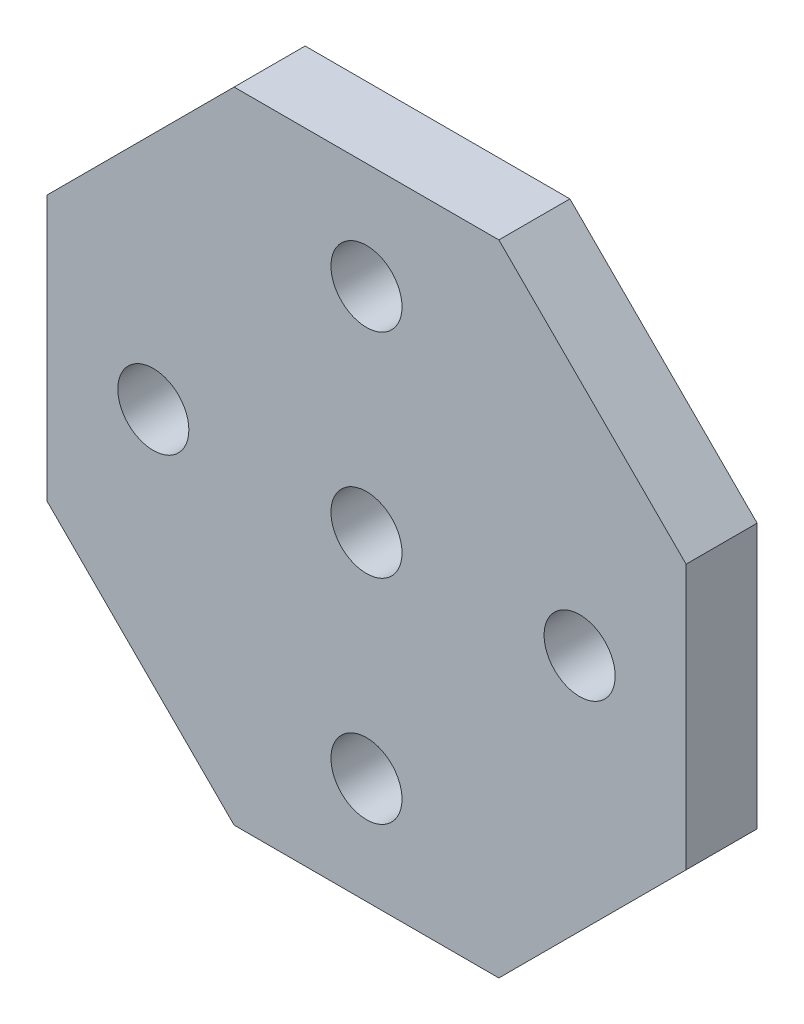
ISO-10303-21;
HEADER;
FILE_DESCRIPTION(('STEP AP214'),'2;1');
FILE_NAME('part.step','',(''),(''),'','','');
FILE_SCHEMA(('AUTOMOTIVE_DESIGN { 1 0 10303 214 1 1 1 1 }'));
ENDSEC;
DATA;
#1=APPLICATION_CONTEXT('core data for automotive mechanical design processes');
#2=APPLICATION_PROTOCOL_DEFINITION('international standard','automotive_design',2000,#1);
#3=PRODUCT_CONTEXT('',#1,'mechanical');
#4=PRODUCT('Part','Part','',(#3));
#5=PRODUCT_RELATED_PRODUCT_CATEGORY('part','',(#4));
#6=PRODUCT_DEFINITION_FORMATION('','',#4);
#7=PRODUCT_DEFINITION_CONTEXT('part definition',#1,'design');
#8=PRODUCT_DEFINITION('design','',#6,#7);
#9=PRODUCT_DEFINITION_SHAPE('','',#8);
#10=(LENGTH_UNIT() NAMED_UNIT(*) SI_UNIT(.MILLI.,.METRE.));
#11=(NAMED_UNIT(*) PLANE_ANGLE_UNIT() SI_UNIT($,.RADIAN.));
#12=(NAMED_UNIT(*) SI_UNIT($,.STERADIAN.) SOLID_ANGLE_UNIT());
#13=UNCERTAINTY_MEASURE_WITH_UNIT(LENGTH_MEASURE(1.E-05),#10,'distance_accuracy_value','');
#14=(GEOMETRIC_REPRESENTATION_CONTEXT(3) GLOBAL_UNCERTAINTY_ASSIGNED_CONTEXT((#13)) GLOBAL_UNIT_ASSIGNED_CONTEXT((#10,
#11,#12)) REPRESENTATION_CONTEXT('',''));
#15=CARTESIAN_POINT('',(0.,0.,0.));
#16=DIRECTION('',(0.,0.,1.));
#17=DIRECTION('',(1.,0.,0.));
#18=AXIS2_PLACEMENT_3D('',#15,#16,#17);
#19=CARTESIAN_POINT('',(0.,0.,3.));
#20=DIRECTION('',(0.,0.,-1.));
#21=DIRECTION('',(-1.,0.,0.));
#22=AXIS2_PLACEMENT_3D('',#19,#20,#21);
#23=PLANE('',#22);
#24=CARTESIAN_POINT('',(224.7478079135,241.9520199932,3.));
#25=DIRECTION('',(0.,0.,1.));
#26=DIRECTION('',(1.,0.,0.));
#27=AXIS2_PLACEMENT_3D('',#24,#25,#26);
#28=CIRCLE('',#27,1.5);
#29=CARTESIAN_POINT('',(226.2478079135,241.9520199932,3.));
#30=VERTEX_POINT('',#29);
#31=EDGE_CURVE('E194',#30,#30,#28,.T.);
#32=ORIENTED_EDGE('',*,*,#31,.F.);
#33=EDGE_LOOP('',(#32));
#34=FACE_BOUND('',#33,.T.);
#35=CARTESIAN_POINT('',(215.7478079135,232.9520199932,3.));
#36=DIRECTION('',(0.,0.,1.));
#37=DIRECTION('',(1.,0.,0.));
#38=AXIS2_PLACEMENT_3D('',#35,#36,#37);
#39=CIRCLE('',#38,1.5);
#40=CARTESIAN_POINT('',(217.2478079135,232.9520199932,3.));
#41=VERTEX_POINT('',#40);
#42=EDGE_CURVE('E182',#41,#41,#39,.T.);
#43=ORIENTED_EDGE('',*,*,#42,.F.);
#44=EDGE_LOOP('',(#43));
#45=FACE_BOUND('',#44,.T.);
#46=DIRECTION('',(0.707106781186547,0.707106781186547,0.));
#47=VECTOR('',#46,1.);
#48=CARTESIAN_POINT('',(229.2428079135,236.362207969,3.));
#49=LINE('',#48,#47);
#50=CARTESIAN_POINT('',(221.3376199377,228.4570199932,3.));
#51=VERTEX_POINT('',#50);
#52=CARTESIAN_POINT('',(229.2428079135,236.362207969,3.));
#53=VERTEX_POINT('',#52);
#54=EDGE_CURVE('E145',#51,#53,#49,.T.);
#55=ORIENTED_EDGE('',*,*,#54,.T.);
#56=DIRECTION('',(0.,1.,0.));
#57=VECTOR('',#56,1.);
#58=CARTESIAN_POINT('',(229.2428079135,247.5418320174,3.));
#59=LINE('',#58,#57);
#60=CARTESIAN_POINT('',(229.2428079135,247.5418320174,3.));
#61=VERTEX_POINT('',#60);
#62=EDGE_CURVE('E93',#53,#61,#59,.T.);
#63=ORIENTED_EDGE('',*,*,#62,.T.);
#64=DIRECTION('',(-0.707106781186547,0.707106781186547,0.));
#65=VECTOR('',#64,1.);
#66=CARTESIAN_POINT('',(221.3376199377,255.4470199932,3.));
#67=LINE('',#66,#65);
#68=CARTESIAN_POINT('',(221.3376199377,255.4470199932,3.));
#69=VERTEX_POINT('',#68);
#70=EDGE_CURVE('E160',#61,#69,#67,.T.);
#71=ORIENTED_EDGE('',*,*,#70,.T.);
#72=DIRECTION('',(-1.,0.,0.));
#73=VECTOR('',#72,1.);
#74=CARTESIAN_POINT('',(210.1579958893,255.4470199932,3.));
#75=LINE('',#74,#73);
#76=CARTESIAN_POINT('',(210.1579958893,255.4470199932,3.));
#77=VERTEX_POINT('',#76);
#78=EDGE_CURVE('E173',#69,#77,#75,.T.);
#79=ORIENTED_EDGE('',*,*,#78,.T.);
#80=DIRECTION('',(-0.707106781186547,-0.707106781186547,0.));
#81=VECTOR('',#80,1.);
#82=CARTESIAN_POINT('',(202.2528079135,247.5418320174,3.));
#83=LINE('',#82,#81);
#84=CARTESIAN_POINT('',(202.2528079135,247.5418320174,3.));
#85=VERTEX_POINT('',#84);
#86=EDGE_CURVE('E112',#77,#85,#83,.T.);
#87=ORIENTED_EDGE('',*,*,#86,.T.);
#88=DIRECTION('',(0.,-1.,0.));
#89=VECTOR('',#88,1.);
#90=CARTESIAN_POINT('',(202.2528079135,236.362207969,3.));
#91=LINE('',#90,#89);
#92=CARTESIAN_POINT('',(202.2528079135,236.362207969,3.));
#93=VERTEX_POINT('',#92);
#94=EDGE_CURVE('E106',#85,#93,#91,.T.);
#95=ORIENTED_EDGE('',*,*,#94,.T.);
#96=DIRECTION('',(0.707106781186547,-0.707106781186547,0.));
#97=VECTOR('',#96,1.);
#98=CARTESIAN_POINT('',(210.1579958893,228.4570199932,3.));
#99=LINE('',#98,#97);
#100=CARTESIAN_POINT('',(210.1579958893,228.4570199932,3.));
#101=VERTEX_POINT('',#100);
#102=EDGE_CURVE('E110',#93,#101,#99,.T.);
#103=ORIENTED_EDGE('',*,*,#102,.T.);
#104=DIRECTION('',(1.,0.,0.));
#105=VECTOR('',#104,1.);
#106=CARTESIAN_POINT('',(221.3376199377,228.4570199932,3.));
#107=LINE('',#106,#105);
#108=EDGE_CURVE('E50',#101,#51,#107,.T.);
#109=ORIENTED_EDGE('',*,*,#108,.T.);
#110=EDGE_LOOP('',(#55,#63,#71,#79,#87,#95,#103,#109));
#111=FACE_BOUND('',#110,.T.);
#112=CARTESIAN_POINT('',(215.7478079135,241.9520199932,3.));
#113=DIRECTION('',(0.,0.,1.));
#114=DIRECTION('',(1.,0.,0.));
#115=AXIS2_PLACEMENT_3D('',#112,#113,#114);
#116=CIRCLE('',#115,1.5);
#117=CARTESIAN_POINT('',(217.2478079135,241.9520199932,3.));
#118=VERTEX_POINT('',#117);
#119=EDGE_CURVE('E134',#118,#118,#116,.T.);
#120=ORIENTED_EDGE('',*,*,#119,.F.);
#121=EDGE_LOOP('',(#120));
#122=FACE_BOUND('',#121,.T.);
#123=CARTESIAN_POINT('',(215.7478079135,250.9520199932,3.));
#124=DIRECTION('',(0.,0.,1.));
#125=DIRECTION('',(1.,0.,0.));
#126=AXIS2_PLACEMENT_3D('',#123,#124,#125);
#127=CIRCLE('',#126,1.5);
#128=CARTESIAN_POINT('',(217.2478079135,250.9520199932,3.));
#129=VERTEX_POINT('',#128);
#130=EDGE_CURVE('E188',#129,#129,#127,.T.);
#131=ORIENTED_EDGE('',*,*,#130,.F.);
#132=EDGE_LOOP('',(#131));
#133=FACE_BOUND('',#132,.T.);
#134=CARTESIAN_POINT('',(206.7478079135,241.9520199932,3.));
#135=DIRECTION('',(0.,0.,1.));
#136=DIRECTION('',(1.,0.,0.));
#137=AXIS2_PLACEMENT_3D('',#134,#135,#136);
#138=CIRCLE('',#137,1.5);
#139=CARTESIAN_POINT('',(208.2478079135,241.9520199932,3.));
#140=VERTEX_POINT('',#139);
#141=EDGE_CURVE('E200',#140,#140,#138,.T.);
#142=ORIENTED_EDGE('',*,*,#141,.F.);
#143=EDGE_LOOP('',(#142));
#144=FACE_BOUND('',#143,.T.);
#145=ADVANCED_FACE('F33',(#34,#45,#111,#122,#133,#144),#23,.F.);
#146=CARTESIAN_POINT('',(0.,0.,0.));
#147=DIRECTION('',(0.,0.,-1.));
#148=DIRECTION('',(-1.,0.,0.));
#149=AXIS2_PLACEMENT_3D('',#146,#147,#148);
#150=PLANE('',#149);
#151=CARTESIAN_POINT('',(224.7478079135,241.9520199932,0.));
#152=DIRECTION('',(0.,0.,1.));
#153=DIRECTION('',(1.,0.,0.));
#154=AXIS2_PLACEMENT_3D('',#151,#152,#153);
#155=CIRCLE('',#154,1.5);
#156=CARTESIAN_POINT('',(226.2478079135,241.9520199932,0.));
#157=VERTEX_POINT('',#156);
#158=EDGE_CURVE('E197',#157,#157,#155,.T.);
#159=ORIENTED_EDGE('',*,*,#158,.T.);
#160=EDGE_LOOP('',(#159));
#161=FACE_BOUND('',#160,.T.);
#162=CARTESIAN_POINT('',(215.7478079135,232.9520199932,0.));
#163=DIRECTION('',(0.,0.,1.));
#164=DIRECTION('',(1.,0.,0.));
#165=AXIS2_PLACEMENT_3D('',#162,#163,#164);
#166=CIRCLE('',#165,1.5);
#167=CARTESIAN_POINT('',(217.2478079135,232.9520199932,0.));
#168=VERTEX_POINT('',#167);
#169=EDGE_CURVE('E185',#168,#168,#166,.T.);
#170=ORIENTED_EDGE('',*,*,#169,.T.);
#171=EDGE_LOOP('',(#170));
#172=FACE_BOUND('',#171,.T.);
#173=DIRECTION('',(0.707106781186547,0.707106781186547,0.));
#174=VECTOR('',#173,1.);
#175=CARTESIAN_POINT('',(229.2428079135,236.362207969,0.));
#176=LINE('',#175,#174);
#177=CARTESIAN_POINT('',(221.3376199377,228.4570199932,0.));
#178=VERTEX_POINT('',#177);
#179=CARTESIAN_POINT('',(229.2428079135,236.362207969,0.));
#180=VERTEX_POINT('',#179);
#181=EDGE_CURVE('E130',#178,#180,#176,.T.);
#182=ORIENTED_EDGE('',*,*,#181,.F.);
#183=DIRECTION('',(1.,0.,0.));
#184=VECTOR('',#183,1.);
#185=CARTESIAN_POINT('',(221.3376199377,228.4570199932,0.));
#186=LINE('',#185,#184);
#187=CARTESIAN_POINT('',(210.1579958893,228.4570199932,0.));
#188=VERTEX_POINT('',#187);
#189=EDGE_CURVE('E85',#188,#178,#186,.T.);
#190=ORIENTED_EDGE('',*,*,#189,.F.);
#191=DIRECTION('',(0.707106781186547,-0.707106781186547,0.));
#192=VECTOR('',#191,1.);
#193=CARTESIAN_POINT('',(210.1579958893,228.4570199932,0.));
#194=LINE('',#193,#192);
#195=CARTESIAN_POINT('',(202.2528079135,236.362207969,0.));
#196=VERTEX_POINT('',#195);
#197=EDGE_CURVE('E79',#196,#188,#194,.T.);
#198=ORIENTED_EDGE('',*,*,#197,.F.);
#199=DIRECTION('',(0.,-1.,0.));
#200=VECTOR('',#199,1.);
#201=CARTESIAN_POINT('',(202.2528079135,236.362207969,0.));
#202=LINE('',#201,#200);
#203=CARTESIAN_POINT('',(202.2528079135,247.5418320174,0.));
#204=VERTEX_POINT('',#203);
#205=EDGE_CURVE('E120',#204,#196,#202,.T.);
#206=ORIENTED_EDGE('',*,*,#205,.F.);
#207=DIRECTION('',(-0.707106781186547,-0.707106781186547,0.));
#208=VECTOR('',#207,1.);
#209=CARTESIAN_POINT('',(202.2528079135,247.5418320174,0.));
#210=LINE('',#209,#208);
#211=CARTESIAN_POINT('',(210.1579958893,255.4470199932,0.));
#212=VERTEX_POINT('',#211);
#213=EDGE_CURVE('E140',#212,#204,#210,.T.);
#214=ORIENTED_EDGE('',*,*,#213,.F.);
#215=DIRECTION('',(-1.,0.,0.));
#216=VECTOR('',#215,1.);
#217=CARTESIAN_POINT('',(210.1579958893,255.4470199932,0.));
#218=LINE('',#217,#216);
#219=CARTESIAN_POINT('',(221.3376199377,255.4470199932,0.));
#220=VERTEX_POINT('',#219);
#221=EDGE_CURVE('E138',#220,#212,#218,.T.);
#222=ORIENTED_EDGE('',*,*,#221,.F.);
#223=DIRECTION('',(-0.707106781186547,0.707106781186547,0.));
#224=VECTOR('',#223,1.);
#225=CARTESIAN_POINT('',(221.3376199377,255.4470199932,0.));
#226=LINE('',#225,#224);
#227=CARTESIAN_POINT('',(229.2428079135,247.5418320174,0.));
#228=VERTEX_POINT('',#227);
#229=EDGE_CURVE('E136',#228,#220,#226,.T.);
#230=ORIENTED_EDGE('',*,*,#229,.F.);
#231=DIRECTION('',(0.,1.,0.));
#232=VECTOR('',#231,1.);
#233=CARTESIAN_POINT('',(229.2428079135,247.5418320174,0.));
#234=LINE('',#233,#232);
#235=EDGE_CURVE('E133',#180,#228,#234,.T.);
#236=ORIENTED_EDGE('',*,*,#235,.F.);
#237=EDGE_LOOP('',(#182,#190,#198,#206,#214,#222,#230,#236));
#238=FACE_BOUND('',#237,.T.);
#239=CARTESIAN_POINT('',(215.7478079135,241.9520199932,0.));
#240=DIRECTION('',(0.,0.,1.));
#241=DIRECTION('',(1.,0.,0.));
#242=AXIS2_PLACEMENT_3D('',#239,#240,#241);
#243=CIRCLE('',#242,1.5);
#244=CARTESIAN_POINT('',(217.2478079135,241.9520199932,0.));
#245=VERTEX_POINT('',#244);
#246=EDGE_CURVE('E179',#245,#245,#243,.T.);
#247=ORIENTED_EDGE('',*,*,#246,.T.);
#248=EDGE_LOOP('',(#247));
#249=FACE_BOUND('',#248,.T.);
#250=CARTESIAN_POINT('',(215.7478079135,250.9520199932,0.));
#251=DIRECTION('',(0.,0.,1.));
#252=DIRECTION('',(1.,0.,0.));
#253=AXIS2_PLACEMENT_3D('',#250,#251,#252);
#254=CIRCLE('',#253,1.5);
#255=CARTESIAN_POINT('',(217.2478079135,250.9520199932,0.));
#256=VERTEX_POINT('',#255);
#257=EDGE_CURVE('E191',#256,#256,#254,.T.);
#258=ORIENTED_EDGE('',*,*,#257,.T.);
#259=EDGE_LOOP('',(#258));
#260=FACE_BOUND('',#259,.T.);
#261=CARTESIAN_POINT('',(206.7478079135,241.9520199932,0.));
#262=DIRECTION('',(0.,0.,1.));
#263=DIRECTION('',(1.,0.,0.));
#264=AXIS2_PLACEMENT_3D('',#261,#262,#263);
#265=CIRCLE('',#264,1.5);
#266=CARTESIAN_POINT('',(208.2478079135,241.9520199932,0.));
#267=VERTEX_POINT('',#266);
#268=EDGE_CURVE('E203',#267,#267,#265,.T.);
#269=ORIENTED_EDGE('',*,*,#268,.T.);
#270=EDGE_LOOP('',(#269));
#271=FACE_BOUND('',#270,.T.);
#272=ADVANCED_FACE('F164',(#161,#172,#238,#249,#260,#271),#150,.T.);
#273=CARTESIAN_POINT('',(229.2428079135,236.362207969,3.));
#274=DIRECTION('',(-0.707106781186548,0.707106781186548,0.));
#275=DIRECTION('',(-0.707106781186548,-0.707106781186548,0.));
#276=AXIS2_PLACEMENT_3D('',#273,#274,#275);
#277=PLANE('',#276);
#278=ORIENTED_EDGE('',*,*,#181,.T.);
#279=DIRECTION('',(0.,0.,-1.));
#280=VECTOR('',#279,1.);
#281=CARTESIAN_POINT('',(229.2428079135,236.362207969,3.));
#282=LINE('',#281,#280);
#283=EDGE_CURVE('E11',#53,#180,#282,.T.);
#284=ORIENTED_EDGE('',*,*,#283,.F.);
#285=ORIENTED_EDGE('',*,*,#54,.F.);
#286=DIRECTION('',(0.,0.,-1.));
#287=VECTOR('',#286,1.);
#288=CARTESIAN_POINT('',(221.3376199377,228.4570199932,3.));
#289=LINE('',#288,#287);
#290=EDGE_CURVE('E126',#51,#178,#289,.T.);
#291=ORIENTED_EDGE('',*,*,#290,.T.);
#292=EDGE_LOOP('',(#278,#284,#285,#291));
#293=FACE_BOUND('',#292,.T.);
#294=ADVANCED_FACE('F35',(#293),#277,.F.);
#295=CARTESIAN_POINT('',(229.2428079135,247.5418320174,3.));
#296=DIRECTION('',(-1.,0.,0.));
#297=DIRECTION('',(0.,0.,1.));
#298=AXIS2_PLACEMENT_3D('',#295,#296,#297);
#299=PLANE('',#298);
#300=ORIENTED_EDGE('',*,*,#235,.T.);
#301=DIRECTION('',(0.,0.,-1.));
#302=VECTOR('',#301,1.);
#303=CARTESIAN_POINT('',(229.2428079135,247.5418320174,3.));
#304=LINE('',#303,#302);
#305=EDGE_CURVE('E42',#61,#228,#304,.T.);
#306=ORIENTED_EDGE('',*,*,#305,.F.);
#307=ORIENTED_EDGE('',*,*,#62,.F.);
#308=ORIENTED_EDGE('',*,*,#283,.T.);
#309=EDGE_LOOP('',(#300,#306,#307,#308));
#310=FACE_BOUND('',#309,.T.);
#311=ADVANCED_FACE('F238',(#310),#299,.F.);
#312=CARTESIAN_POINT('',(221.3376199377,255.4470199932,3.));
#313=DIRECTION('',(-0.707106781186548,-0.707106781186548,0.));
#314=DIRECTION('',(0.707106781186548,-0.707106781186548,0.));
#315=AXIS2_PLACEMENT_3D('',#312,#313,#314);
#316=PLANE('',#315);
#317=ORIENTED_EDGE('',*,*,#229,.T.);
#318=DIRECTION('',(0.,0.,-1.));
#319=VECTOR('',#318,1.);
#320=CARTESIAN_POINT('',(221.3376199377,255.4470199932,3.));
#321=LINE('',#320,#319);
#322=EDGE_CURVE('E152',#69,#220,#321,.T.);
#323=ORIENTED_EDGE('',*,*,#322,.F.);
#324=ORIENTED_EDGE('',*,*,#70,.F.);
#325=ORIENTED_EDGE('',*,*,#305,.T.);
#326=EDGE_LOOP('',(#317,#323,#324,#325));
#327=FACE_BOUND('',#326,.T.);
#328=ADVANCED_FACE('F158',(#327),#316,.F.);
#329=CARTESIAN_POINT('',(210.1579958893,255.4470199932,3.));
#330=DIRECTION('',(0.,-1.,0.));
#331=DIRECTION('',(0.,0.,-1.));
#332=AXIS2_PLACEMENT_3D('',#329,#330,#331);
#333=PLANE('',#332);
#334=ORIENTED_EDGE('',*,*,#221,.T.);
#335=DIRECTION('',(0.,0.,-1.));
#336=VECTOR('',#335,1.);
#337=CARTESIAN_POINT('',(210.1579958893,255.4470199932,3.));
#338=LINE('',#337,#336);
#339=EDGE_CURVE('E149',#77,#212,#338,.T.);
#340=ORIENTED_EDGE('',*,*,#339,.F.);
#341=ORIENTED_EDGE('',*,*,#78,.F.);
#342=ORIENTED_EDGE('',*,*,#322,.T.);
#343=EDGE_LOOP('',(#334,#340,#341,#342));
#344=FACE_BOUND('',#343,.T.);
#345=ADVANCED_FACE('F169',(#344),#333,.F.);
#346=CARTESIAN_POINT('',(202.2528079135,247.5418320174,3.));
#347=DIRECTION('',(0.707106781186548,-0.707106781186548,0.));
#348=DIRECTION('',(0.707106781186548,0.707106781186548,0.));
#349=AXIS2_PLACEMENT_3D('',#346,#347,#348);
#350=PLANE('',#349);
#351=ORIENTED_EDGE('',*,*,#213,.T.);
#352=DIRECTION('',(0.,0.,-1.));
#353=VECTOR('',#352,1.);
#354=CARTESIAN_POINT('',(202.2528079135,247.5418320174,3.));
#355=LINE('',#354,#353);
#356=EDGE_CURVE('E121',#85,#204,#355,.T.);
#357=ORIENTED_EDGE('',*,*,#356,.F.);
#358=ORIENTED_EDGE('',*,*,#86,.F.);
#359=ORIENTED_EDGE('',*,*,#339,.T.);
#360=EDGE_LOOP('',(#351,#357,#358,#359));
#361=FACE_BOUND('',#360,.T.);
#362=ADVANCED_FACE('F172',(#361),#350,.F.);
#363=CARTESIAN_POINT('',(202.2528079135,236.362207969,3.));
#364=DIRECTION('',(1.,0.,0.));
#365=DIRECTION('',(0.,0.,-1.));
#366=AXIS2_PLACEMENT_3D('',#363,#364,#365);
#367=PLANE('',#366);
#368=ORIENTED_EDGE('',*,*,#205,.T.);
#369=DIRECTION('',(0.,0.,-1.));
#370=VECTOR('',#369,1.);
#371=CARTESIAN_POINT('',(202.2528079135,236.362207969,3.));
#372=LINE('',#371,#370);
#373=EDGE_CURVE('E117',#93,#196,#372,.T.);
#374=ORIENTED_EDGE('',*,*,#373,.F.);
#375=ORIENTED_EDGE('',*,*,#94,.F.);
#376=ORIENTED_EDGE('',*,*,#356,.T.);
#377=EDGE_LOOP('',(#368,#374,#375,#376));
#378=FACE_BOUND('',#377,.T.);
#379=ADVANCED_FACE('F118',(#378),#367,.F.);
#380=CARTESIAN_POINT('',(210.1579958893,228.4570199932,3.));
#381=DIRECTION('',(0.707106781186548,0.707106781186548,0.));
#382=DIRECTION('',(-0.707106781186548,0.707106781186548,0.));
#383=AXIS2_PLACEMENT_3D('',#380,#381,#382);
#384=PLANE('',#383);
#385=ORIENTED_EDGE('',*,*,#197,.T.);
#386=DIRECTION('',(0.,0.,-1.));
#387=VECTOR('',#386,1.);
#388=CARTESIAN_POINT('',(210.1579958893,228.4570199932,3.));
#389=LINE('',#388,#387);
#390=EDGE_CURVE('E122',#101,#188,#389,.T.);
#391=ORIENTED_EDGE('',*,*,#390,.F.);
#392=ORIENTED_EDGE('',*,*,#102,.F.);
#393=ORIENTED_EDGE('',*,*,#373,.T.);
#394=EDGE_LOOP('',(#385,#391,#392,#393));
#395=FACE_BOUND('',#394,.T.);
#396=ADVANCED_FACE('F124',(#395),#384,.F.);
#397=CARTESIAN_POINT('',(221.3376199377,228.4570199932,3.));
#398=DIRECTION('',(0.,1.,0.));
#399=DIRECTION('',(0.,0.,1.));
#400=AXIS2_PLACEMENT_3D('',#397,#398,#399);
#401=PLANE('',#400);
#402=ORIENTED_EDGE('',*,*,#189,.T.);
#403=ORIENTED_EDGE('',*,*,#290,.F.);
#404=ORIENTED_EDGE('',*,*,#108,.F.);
#405=ORIENTED_EDGE('',*,*,#390,.T.);
#406=EDGE_LOOP('',(#402,#403,#404,#405));
#407=FACE_BOUND('',#406,.T.);
#408=ADVANCED_FACE('F226',(#407),#401,.F.);
#409=CARTESIAN_POINT('',(215.7478079135,241.9520199932,3.));
#410=DIRECTION('',(0.,0.,-1.));
#411=DIRECTION('',(-1.,0.,0.));
#412=AXIS2_PLACEMENT_3D('',#409,#410,#411);
#413=CYLINDRICAL_SURFACE('',#412,1.5);
#414=ORIENTED_EDGE('',*,*,#119,.T.);
#415=EDGE_LOOP('',(#414));
#416=FACE_BOUND('',#415,.T.);
#417=ORIENTED_EDGE('',*,*,#246,.F.);
#418=EDGE_LOOP('',(#417));
#419=FACE_BOUND('',#418,.T.);
#420=ADVANCED_FACE('F223',(#416,#419),#413,.F.);
#421=CARTESIAN_POINT('',(215.7478079135,232.9520199932,3.));
#422=DIRECTION('',(0.,0.,-1.));
#423=DIRECTION('',(-1.,0.,0.));
#424=AXIS2_PLACEMENT_3D('',#421,#422,#423);
#425=CYLINDRICAL_SURFACE('',#424,1.5);
#426=ORIENTED_EDGE('',*,*,#42,.T.);
#427=EDGE_LOOP('',(#426));
#428=FACE_BOUND('',#427,.T.);
#429=ORIENTED_EDGE('',*,*,#169,.F.);
#430=EDGE_LOOP('',(#429));
#431=FACE_BOUND('',#430,.T.);
#432=ADVANCED_FACE('F302',(#428,#431),#425,.F.);
#433=CARTESIAN_POINT('',(215.7478079135,250.9520199932,3.));
#434=DIRECTION('',(0.,0.,-1.));
#435=DIRECTION('',(-1.,0.,0.));
#436=AXIS2_PLACEMENT_3D('',#433,#434,#435);
#437=CYLINDRICAL_SURFACE('',#436,1.5);
#438=ORIENTED_EDGE('',*,*,#130,.T.);
#439=EDGE_LOOP('',(#438));
#440=FACE_BOUND('',#439,.T.);
#441=ORIENTED_EDGE('',*,*,#257,.F.);
#442=EDGE_LOOP('',(#441));
#443=FACE_BOUND('',#442,.T.);
#444=ADVANCED_FACE('F310',(#440,#443),#437,.F.);
#445=CARTESIAN_POINT('',(224.7478079135,241.9520199932,3.));
#446=DIRECTION('',(0.,0.,-1.));
#447=DIRECTION('',(-1.,0.,0.));
#448=AXIS2_PLACEMENT_3D('',#445,#446,#447);
#449=CYLINDRICAL_SURFACE('',#448,1.5);
#450=ORIENTED_EDGE('',*,*,#31,.T.);
#451=EDGE_LOOP('',(#450));
#452=FACE_BOUND('',#451,.T.);
#453=ORIENTED_EDGE('',*,*,#158,.F.);
#454=EDGE_LOOP('',(#453));
#455=FACE_BOUND('',#454,.T.);
#456=ADVANCED_FACE('F318',(#452,#455),#449,.F.);
#457=CARTESIAN_POINT('',(206.7478079135,241.9520199932,3.));
#458=DIRECTION('',(0.,0.,-1.));
#459=DIRECTION('',(-1.,0.,0.));
#460=AXIS2_PLACEMENT_3D('',#457,#458,#459);
#461=CYLINDRICAL_SURFACE('',#460,1.5);
#462=ORIENTED_EDGE('',*,*,#141,.T.);
#463=EDGE_LOOP('',(#462));
#464=FACE_BOUND('',#463,.T.);
#465=ORIENTED_EDGE('',*,*,#268,.F.);
#466=EDGE_LOOP('',(#465));
#467=FACE_BOUND('',#466,.T.);
#468=ADVANCED_FACE('F209',(#464,#467),#461,.F.);
#469=CLOSED_SHELL('',(#145,#272,#294,#311,#328,#345,#362,#379,#396,#408,#420,#432,#444,#456,#468));
#470=MANIFOLD_SOLID_BREP('B2',#469);
#471=ADVANCED_BREP_SHAPE_REPRESENTATION('',(#18,#470),#14);
#472=SHAPE_DEFINITION_REPRESENTATION(#9,#471);
ENDSEC;
END-ISO-10303-21;
